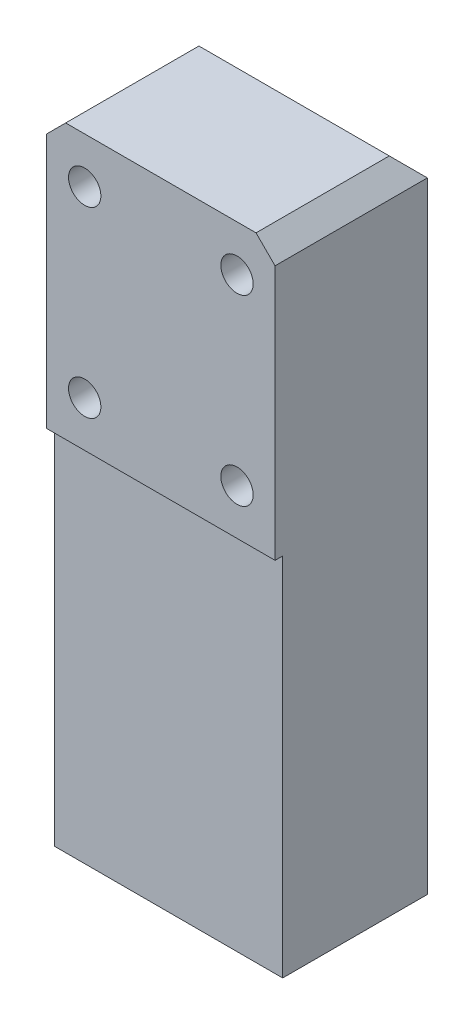
ISO-10303-21;
HEADER;
FILE_DESCRIPTION(('STEP AP214'),'2;1');
FILE_NAME('part.step','',(''),(''),'','','');
FILE_SCHEMA(('AUTOMOTIVE_DESIGN { 1 0 10303 214 1 1 1 1 }'));
ENDSEC;
DATA;
#1=APPLICATION_CONTEXT('core data for automotive mechanical design processes');
#2=APPLICATION_PROTOCOL_DEFINITION('international standard','automotive_design',2000,#1);
#3=PRODUCT_CONTEXT('',#1,'mechanical');
#4=PRODUCT('Part','Part','',(#3));
#5=PRODUCT_RELATED_PRODUCT_CATEGORY('part','',(#4));
#6=PRODUCT_DEFINITION_FORMATION('','',#4);
#7=PRODUCT_DEFINITION_CONTEXT('part definition',#1,'design');
#8=PRODUCT_DEFINITION('design','',#6,#7);
#9=PRODUCT_DEFINITION_SHAPE('','',#8);
#10=(LENGTH_UNIT() NAMED_UNIT(*) SI_UNIT(.MILLI.,.METRE.));
#11=(NAMED_UNIT(*) PLANE_ANGLE_UNIT() SI_UNIT($,.RADIAN.));
#12=(NAMED_UNIT(*) SI_UNIT($,.STERADIAN.) SOLID_ANGLE_UNIT());
#13=UNCERTAINTY_MEASURE_WITH_UNIT(LENGTH_MEASURE(1.E-05),#10,'distance_accuracy_value','');
#14=(GEOMETRIC_REPRESENTATION_CONTEXT(3) GLOBAL_UNCERTAINTY_ASSIGNED_CONTEXT((#13)) GLOBAL_UNIT_ASSIGNED_CONTEXT((#10,
#11,#12)) REPRESENTATION_CONTEXT('',''));
#15=CARTESIAN_POINT('',(0.,0.,0.));
#16=DIRECTION('',(0.,0.,1.));
#17=DIRECTION('',(1.,0.,0.));
#18=AXIS2_PLACEMENT_3D('',#15,#16,#17);
#19=CARTESIAN_POINT('',(-30.,-168.,0.));
#20=DIRECTION('',(0.,0.,-1.));
#21=DIRECTION('',(-1.,0.,0.));
#22=AXIS2_PLACEMENT_3D('',#19,#20,#21);
#23=PLANE('',#22);
#24=CARTESIAN_POINT('',(-20.,-60.,0.));
#25=DIRECTION('',(0.,0.,-1.));
#26=DIRECTION('',(-1.,0.,0.));
#27=AXIS2_PLACEMENT_3D('',#24,#25,#26);
#28=CIRCLE('',#27,6.5);
#29=CARTESIAN_POINT('',(-26.5,-60.,0.));
#30=VERTEX_POINT('',#29);
#31=EDGE_CURVE('E521',#30,#30,#28,.T.);
#32=ORIENTED_EDGE('',*,*,#31,.F.);
#33=EDGE_LOOP('',(#32));
#34=FACE_BOUND('',#33,.T.);
#35=CARTESIAN_POINT('',(20.,-60.,0.));
#36=DIRECTION('',(0.,0.,-1.));
#37=DIRECTION('',(-1.,0.,0.));
#38=AXIS2_PLACEMENT_3D('',#35,#36,#37);
#39=CIRCLE('',#38,6.5);
#40=CARTESIAN_POINT('',(13.5,-60.,0.));
#41=VERTEX_POINT('',#40);
#42=EDGE_CURVE('E527',#41,#41,#39,.T.);
#43=ORIENTED_EDGE('',*,*,#42,.F.);
#44=EDGE_LOOP('',(#43));
#45=FACE_BOUND('',#44,.T.);
#46=CARTESIAN_POINT('',(-20.,-12.,0.));
#47=DIRECTION('',(0.,0.,-1.));
#48=DIRECTION('',(-1.,0.,0.));
#49=AXIS2_PLACEMENT_3D('',#46,#47,#48);
#50=CIRCLE('',#49,6.5);
#51=CARTESIAN_POINT('',(-26.5,-12.,0.));
#52=VERTEX_POINT('',#51);
#53=EDGE_CURVE('E533',#52,#52,#50,.T.);
#54=ORIENTED_EDGE('',*,*,#53,.F.);
#55=EDGE_LOOP('',(#54));
#56=FACE_BOUND('',#55,.T.);
#57=CARTESIAN_POINT('',(20.,-12.,0.));
#58=DIRECTION('',(0.,0.,-1.));
#59=DIRECTION('',(-1.,0.,0.));
#60=AXIS2_PLACEMENT_3D('',#57,#58,#59);
#61=CIRCLE('',#60,6.5);
#62=CARTESIAN_POINT('',(13.5,-12.,0.));
#63=VERTEX_POINT('',#62);
#64=EDGE_CURVE('E539',#63,#63,#61,.T.);
#65=ORIENTED_EDGE('',*,*,#64,.F.);
#66=EDGE_LOOP('',(#65));
#67=FACE_BOUND('',#66,.T.);
#68=DIRECTION('',(0.,1.,0.));
#69=VECTOR('',#68,1.);
#70=CARTESIAN_POINT('',(-30.,-168.,0.));
#71=LINE('',#70,#69);
#72=CARTESIAN_POINT('',(-30.,-168.,0.));
#73=VERTEX_POINT('',#72);
#74=CARTESIAN_POINT('',(-30.,-5.,0.));
#75=VERTEX_POINT('',#74);
#76=EDGE_CURVE('E132',#73,#75,#71,.T.);
#77=ORIENTED_EDGE('',*,*,#76,.T.);
#78=DIRECTION('',(1.,0.,0.));
#79=VECTOR('',#78,1.);
#80=CARTESIAN_POINT('',(-30.,-5.,0.));
#81=LINE('',#80,#79);
#82=CARTESIAN_POINT('',(30.,-5.,0.));
#83=VERTEX_POINT('',#82);
#84=EDGE_CURVE('E146',#75,#83,#81,.T.);
#85=ORIENTED_EDGE('',*,*,#84,.T.);
#86=DIRECTION('',(0.,1.,0.));
#87=VECTOR('',#86,1.);
#88=CARTESIAN_POINT('',(30.,-168.,0.));
#89=LINE('',#88,#87);
#90=CARTESIAN_POINT('',(30.,-168.,0.));
#91=VERTEX_POINT('',#90);
#92=EDGE_CURVE('E110',#91,#83,#89,.T.);
#93=ORIENTED_EDGE('',*,*,#92,.F.);
#94=DIRECTION('',(1.,0.,0.));
#95=VECTOR('',#94,1.);
#96=CARTESIAN_POINT('',(-30.,-168.,0.));
#97=LINE('',#96,#95);
#98=EDGE_CURVE('E144',#73,#91,#97,.T.);
#99=ORIENTED_EDGE('',*,*,#98,.F.);
#100=EDGE_LOOP('',(#77,#85,#93,#99));
#101=FACE_BOUND('',#100,.T.);
#102=ADVANCED_FACE('F32',(#34,#45,#56,#67,#101),#23,.T.);
#103=CARTESIAN_POINT('',(-30.,-168.,38.));
#104=DIRECTION('',(0.,-1.,0.));
#105=DIRECTION('',(0.,0.,-1.));
#106=AXIS2_PLACEMENT_3D('',#103,#104,#105);
#107=PLANE('',#106);
#108=CARTESIAN_POINT('',(22.,-168.,8.));
#109=DIRECTION('',(0.,-1.,0.));
#110=DIRECTION('',(0.,0.,-1.));
#111=AXIS2_PLACEMENT_3D('',#108,#109,#110);
#112=CIRCLE('',#111,4.);
#113=CARTESIAN_POINT('',(22.,-168.,4.));
#114=VERTEX_POINT('',#113);
#115=EDGE_CURVE('E477',#114,#114,#112,.T.);
#116=ORIENTED_EDGE('',*,*,#115,.F.);
#117=EDGE_LOOP('',(#116));
#118=FACE_BOUND('',#117,.T.);
#119=CARTESIAN_POINT('',(22.,-168.,30.));
#120=DIRECTION('',(0.,-1.,0.));
#121=DIRECTION('',(0.,0.,-1.));
#122=AXIS2_PLACEMENT_3D('',#119,#120,#121);
#123=CIRCLE('',#122,4.);
#124=CARTESIAN_POINT('',(22.,-168.,26.));
#125=VERTEX_POINT('',#124);
#126=EDGE_CURVE('E476',#125,#125,#123,.T.);
#127=ORIENTED_EDGE('',*,*,#126,.F.);
#128=EDGE_LOOP('',(#127));
#129=FACE_BOUND('',#128,.T.);
#130=CARTESIAN_POINT('',(-22.,-168.,8.));
#131=DIRECTION('',(0.,-1.,0.));
#132=DIRECTION('',(0.,0.,-1.));
#133=AXIS2_PLACEMENT_3D('',#130,#131,#132);
#134=CIRCLE('',#133,4.);
#135=CARTESIAN_POINT('',(-22.,-168.,4.));
#136=VERTEX_POINT('',#135);
#137=EDGE_CURVE('E486',#136,#136,#134,.T.);
#138=ORIENTED_EDGE('',*,*,#137,.F.);
#139=EDGE_LOOP('',(#138));
#140=FACE_BOUND('',#139,.T.);
#141=CARTESIAN_POINT('',(-22.,-168.,30.));
#142=DIRECTION('',(0.,-1.,0.));
#143=DIRECTION('',(0.,0.,-1.));
#144=AXIS2_PLACEMENT_3D('',#141,#142,#143);
#145=CIRCLE('',#144,4.);
#146=CARTESIAN_POINT('',(-22.,-168.,26.));
#147=VERTEX_POINT('',#146);
#148=EDGE_CURVE('E491',#147,#147,#145,.T.);
#149=ORIENTED_EDGE('',*,*,#148,.F.);
#150=EDGE_LOOP('',(#149));
#151=FACE_BOUND('',#150,.T.);
#152=ORIENTED_EDGE('',*,*,#98,.T.);
#153=DIRECTION('',(0.,0.,-1.));
#154=VECTOR('',#153,1.);
#155=CARTESIAN_POINT('',(30.,-168.,38.));
#156=LINE('',#155,#154);
#157=CARTESIAN_POINT('',(30.,-168.,38.));
#158=VERTEX_POINT('',#157);
#159=EDGE_CURVE('E126',#158,#91,#156,.T.);
#160=ORIENTED_EDGE('',*,*,#159,.F.);
#161=DIRECTION('',(1.,0.,0.));
#162=VECTOR('',#161,1.);
#163=CARTESIAN_POINT('',(-30.,-168.,38.));
#164=LINE('',#163,#162);
#165=CARTESIAN_POINT('',(-30.,-168.,38.));
#166=VERTEX_POINT('',#165);
#167=EDGE_CURVE('E147',#166,#158,#164,.T.);
#168=ORIENTED_EDGE('',*,*,#167,.F.);
#169=DIRECTION('',(0.,0.,-1.));
#170=VECTOR('',#169,1.);
#171=CARTESIAN_POINT('',(-30.,-168.,38.));
#172=LINE('',#171,#170);
#173=EDGE_CURVE('E141',#166,#73,#172,.T.);
#174=ORIENTED_EDGE('',*,*,#173,.T.);
#175=EDGE_LOOP('',(#152,#160,#168,#174));
#176=FACE_BOUND('',#175,.T.);
#177=ADVANCED_FACE('F185',(#118,#129,#140,#151,#176),#107,.T.);
#178=CARTESIAN_POINT('',(-30.,-72.,38.));
#179=DIRECTION('',(0.,0.,1.));
#180=DIRECTION('',(0.,-1.,0.));
#181=AXIS2_PLACEMENT_3D('',#178,#179,#180);
#182=PLANE('',#181);
#183=ORIENTED_EDGE('',*,*,#167,.T.);
#184=DIRECTION('',(0.,-1.,0.));
#185=VECTOR('',#184,1.);
#186=CARTESIAN_POINT('',(30.,-72.,38.));
#187=LINE('',#186,#185);
#188=CARTESIAN_POINT('',(30.,-72.,38.));
#189=VERTEX_POINT('',#188);
#190=EDGE_CURVE('E124',#189,#158,#187,.T.);
#191=ORIENTED_EDGE('',*,*,#190,.F.);
#192=DIRECTION('',(1.,0.,0.));
#193=VECTOR('',#192,1.);
#194=CARTESIAN_POINT('',(-30.,-72.,38.));
#195=LINE('',#194,#193);
#196=CARTESIAN_POINT('',(-30.,-72.,38.));
#197=VERTEX_POINT('',#196);
#198=EDGE_CURVE('E120',#197,#189,#195,.T.);
#199=ORIENTED_EDGE('',*,*,#198,.F.);
#200=DIRECTION('',(0.,-1.,0.));
#201=VECTOR('',#200,1.);
#202=CARTESIAN_POINT('',(-30.,-72.,38.));
#203=LINE('',#202,#201);
#204=EDGE_CURVE('E138',#197,#166,#203,.T.);
#205=ORIENTED_EDGE('',*,*,#204,.T.);
#206=EDGE_LOOP('',(#183,#191,#199,#205));
#207=FACE_BOUND('',#206,.T.);
#208=ADVANCED_FACE('F183',(#207),#182,.T.);
#209=CARTESIAN_POINT('',(-30.,-72.,40.));
#210=DIRECTION('',(0.,-1.,0.));
#211=DIRECTION('',(0.,0.,-1.));
#212=AXIS2_PLACEMENT_3D('',#209,#210,#211);
#213=PLANE('',#212);
#214=ORIENTED_EDGE('',*,*,#198,.T.);
#215=DIRECTION('',(0.,0.,-1.));
#216=VECTOR('',#215,1.);
#217=CARTESIAN_POINT('',(30.,-72.,40.));
#218=LINE('',#217,#216);
#219=CARTESIAN_POINT('',(30.,-72.,40.));
#220=VERTEX_POINT('',#219);
#221=EDGE_CURVE('E105',#220,#189,#218,.T.);
#222=ORIENTED_EDGE('',*,*,#221,.F.);
#223=DIRECTION('',(1.,0.,0.));
#224=VECTOR('',#223,1.);
#225=CARTESIAN_POINT('',(-30.,-72.,40.));
#226=LINE('',#225,#224);
#227=CARTESIAN_POINT('',(-30.,-72.,40.));
#228=VERTEX_POINT('',#227);
#229=EDGE_CURVE('E113',#228,#220,#226,.T.);
#230=ORIENTED_EDGE('',*,*,#229,.F.);
#231=DIRECTION('',(0.,0.,-1.));
#232=VECTOR('',#231,1.);
#233=CARTESIAN_POINT('',(-30.,-72.,40.));
#234=LINE('',#233,#232);
#235=EDGE_CURVE('E136',#228,#197,#234,.T.);
#236=ORIENTED_EDGE('',*,*,#235,.T.);
#237=EDGE_LOOP('',(#214,#222,#230,#236));
#238=FACE_BOUND('',#237,.T.);
#239=ADVANCED_FACE('F123',(#238),#213,.T.);
#240=CARTESIAN_POINT('',(-30.,0.,40.));
#241=DIRECTION('',(0.,0.,1.));
#242=DIRECTION('',(0.,-1.,0.));
#243=AXIS2_PLACEMENT_3D('',#240,#241,#242);
#244=PLANE('',#243);
#245=CARTESIAN_POINT('',(20.,-60.,40.));
#246=DIRECTION('',(0.,0.,1.));
#247=DIRECTION('',(0.,-1.,0.));
#248=AXIS2_PLACEMENT_3D('',#245,#246,#247);
#249=CIRCLE('',#248,4.25);
#250=CARTESIAN_POINT('',(20.,-64.25,40.));
#251=VERTEX_POINT('',#250);
#252=EDGE_CURVE('E497',#251,#251,#249,.F.);
#253=ORIENTED_EDGE('',*,*,#252,.T.);
#254=EDGE_LOOP('',(#253));
#255=FACE_BOUND('',#254,.T.);
#256=CARTESIAN_POINT('',(-20.,-60.,40.));
#257=DIRECTION('',(0.,0.,1.));
#258=DIRECTION('',(0.,-1.,0.));
#259=AXIS2_PLACEMENT_3D('',#256,#257,#258);
#260=CIRCLE('',#259,4.25);
#261=CARTESIAN_POINT('',(-20.,-64.25,40.));
#262=VERTEX_POINT('',#261);
#263=EDGE_CURVE('E503',#262,#262,#260,.F.);
#264=ORIENTED_EDGE('',*,*,#263,.T.);
#265=EDGE_LOOP('',(#264));
#266=FACE_BOUND('',#265,.T.);
#267=CARTESIAN_POINT('',(-20.,-12.,40.));
#268=DIRECTION('',(0.,0.,1.));
#269=DIRECTION('',(0.,-1.,0.));
#270=AXIS2_PLACEMENT_3D('',#267,#268,#269);
#271=CIRCLE('',#270,4.25);
#272=CARTESIAN_POINT('',(-20.,-16.25,40.));
#273=VERTEX_POINT('',#272);
#274=EDGE_CURVE('E509',#273,#273,#271,.F.);
#275=ORIENTED_EDGE('',*,*,#274,.T.);
#276=EDGE_LOOP('',(#275));
#277=FACE_BOUND('',#276,.T.);
#278=CARTESIAN_POINT('',(20.,-12.,40.));
#279=DIRECTION('',(0.,0.,1.));
#280=DIRECTION('',(0.,-1.,0.));
#281=AXIS2_PLACEMENT_3D('',#278,#279,#280);
#282=CIRCLE('',#281,4.25);
#283=CARTESIAN_POINT('',(20.,-16.25,40.));
#284=VERTEX_POINT('',#283);
#285=EDGE_CURVE('E515',#284,#284,#282,.F.);
#286=ORIENTED_EDGE('',*,*,#285,.T.);
#287=EDGE_LOOP('',(#286));
#288=FACE_BOUND('',#287,.T.);
#289=DIRECTION('',(0.,-1.,0.));
#290=VECTOR('',#289,1.);
#291=CARTESIAN_POINT('',(30.,0.,40.));
#292=LINE('',#291,#290);
#293=CARTESIAN_POINT('',(30.,-5.00000000000003,40.));
#294=VERTEX_POINT('',#293);
#295=EDGE_CURVE('E99',#294,#220,#292,.T.);
#296=ORIENTED_EDGE('',*,*,#295,.F.);
#297=DIRECTION('',(0.707106781186549,-0.707106781186546,0.));
#298=VECTOR('',#297,1.);
#299=CARTESIAN_POINT('',(-2.50000000000018,27.5,40.));
#300=LINE('',#299,#298);
#301=CARTESIAN_POINT('',(24.9999999999999,0.,40.));
#302=VERTEX_POINT('',#301);
#303=EDGE_CURVE('E158',#294,#302,#300,.F.);
#304=ORIENTED_EDGE('',*,*,#303,.T.);
#305=DIRECTION('',(1.,0.,0.));
#306=VECTOR('',#305,1.);
#307=CARTESIAN_POINT('',(-30.,0.,40.));
#308=LINE('',#307,#306);
#309=CARTESIAN_POINT('',(-25.,0.,40.));
#310=VERTEX_POINT('',#309);
#311=EDGE_CURVE('E121',#310,#302,#308,.T.);
#312=ORIENTED_EDGE('',*,*,#311,.F.);
#313=DIRECTION('',(-0.707106781186546,-0.707106781186549,0.));
#314=VECTOR('',#313,1.);
#315=CARTESIAN_POINT('',(-27.5,-2.50000000000002,40.));
#316=LINE('',#315,#314);
#317=CARTESIAN_POINT('',(-30.,-5.00000000000006,40.));
#318=VERTEX_POINT('',#317);
#319=EDGE_CURVE('E156',#310,#318,#316,.T.);
#320=ORIENTED_EDGE('',*,*,#319,.T.);
#321=DIRECTION('',(0.,-1.,0.));
#322=VECTOR('',#321,1.);
#323=CARTESIAN_POINT('',(-30.,0.,40.));
#324=LINE('',#323,#322);
#325=EDGE_CURVE('E116',#318,#228,#324,.T.);
#326=ORIENTED_EDGE('',*,*,#325,.T.);
#327=ORIENTED_EDGE('',*,*,#229,.T.);
#328=EDGE_LOOP('',(#296,#304,#312,#320,#326,#327));
#329=FACE_BOUND('',#328,.T.);
#330=ADVANCED_FACE('F114',(#255,#266,#277,#288,#329),#244,.T.);
#331=CARTESIAN_POINT('',(-30.,0.,0.));
#332=DIRECTION('',(0.,1.,0.));
#333=DIRECTION('',(0.,0.,1.));
#334=AXIS2_PLACEMENT_3D('',#331,#332,#333);
#335=PLANE('',#334);
#336=ORIENTED_EDGE('',*,*,#311,.T.);
#337=DIRECTION('',(0.,0.,-1.));
#338=VECTOR('',#337,1.);
#339=CARTESIAN_POINT('',(24.9999999999999,0.,0.));
#340=LINE('',#339,#338);
#341=CARTESIAN_POINT('',(24.9999999999999,0.,5.00000000000003));
#342=VERTEX_POINT('',#341);
#343=EDGE_CURVE('E54',#302,#342,#340,.T.);
#344=ORIENTED_EDGE('',*,*,#343,.T.);
#345=DIRECTION('',(-1.,0.,0.));
#346=VECTOR('',#345,1.);
#347=CARTESIAN_POINT('',(-30.,0.,5.00000000000003));
#348=LINE('',#347,#346);
#349=CARTESIAN_POINT('',(-25.,0.,5.00000000000003));
#350=VERTEX_POINT('',#349);
#351=EDGE_CURVE('E153',#342,#350,#348,.T.);
#352=ORIENTED_EDGE('',*,*,#351,.T.);
#353=DIRECTION('',(0.,0.,1.));
#354=VECTOR('',#353,1.);
#355=CARTESIAN_POINT('',(-25.,0.,40.));
#356=LINE('',#355,#354);
#357=EDGE_CURVE('E160',#350,#310,#356,.T.);
#358=ORIENTED_EDGE('',*,*,#357,.T.);
#359=EDGE_LOOP('',(#336,#344,#352,#358));
#360=FACE_BOUND('',#359,.T.);
#361=ADVANCED_FACE('F174',(#360),#335,.T.);
#362=CARTESIAN_POINT('',(-30.,0.,0.));
#363=DIRECTION('',(1.,0.,0.));
#364=DIRECTION('',(0.,0.,-1.));
#365=AXIS2_PLACEMENT_3D('',#362,#363,#364);
#366=PLANE('',#365);
#367=ORIENTED_EDGE('',*,*,#325,.F.);
#368=DIRECTION('',(0.,0.,-1.));
#369=VECTOR('',#368,1.);
#370=CARTESIAN_POINT('',(-30.,-5.00000000000006,5.00000000000003));
#371=LINE('',#370,#369);
#372=EDGE_CURVE('E11',#318,#75,#371,.T.);
#373=ORIENTED_EDGE('',*,*,#372,.T.);
#374=ORIENTED_EDGE('',*,*,#76,.F.);
#375=ORIENTED_EDGE('',*,*,#173,.F.);
#376=ORIENTED_EDGE('',*,*,#204,.F.);
#377=ORIENTED_EDGE('',*,*,#235,.F.);
#378=EDGE_LOOP('',(#367,#373,#374,#375,#376,#377));
#379=FACE_BOUND('',#378,.T.);
#380=ADVANCED_FACE('F179',(#379),#366,.F.);
#381=CARTESIAN_POINT('',(30.,0.,0.));
#382=DIRECTION('',(1.,0.,0.));
#383=DIRECTION('',(0.,0.,-1.));
#384=AXIS2_PLACEMENT_3D('',#381,#382,#383);
#385=PLANE('',#384);
#386=ORIENTED_EDGE('',*,*,#92,.T.);
#387=DIRECTION('',(0.,0.,1.));
#388=VECTOR('',#387,1.);
#389=CARTESIAN_POINT('',(30.,-5.00000000000003,0.));
#390=LINE('',#389,#388);
#391=EDGE_CURVE('E108',#83,#294,#390,.T.);
#392=ORIENTED_EDGE('',*,*,#391,.T.);
#393=ORIENTED_EDGE('',*,*,#295,.T.);
#394=ORIENTED_EDGE('',*,*,#221,.T.);
#395=ORIENTED_EDGE('',*,*,#190,.T.);
#396=ORIENTED_EDGE('',*,*,#159,.T.);
#397=EDGE_LOOP('',(#386,#392,#393,#394,#395,#396));
#398=FACE_BOUND('',#397,.T.);
#399=ADVANCED_FACE('F102',(#398),#385,.T.);
#400=CARTESIAN_POINT('',(-30.,-5.,0.));
#401=DIRECTION('',(0.,-0.707106781186549,0.707106781186546));
#402=DIRECTION('',(1.,0.,0.));
#403=AXIS2_PLACEMENT_3D('',#400,#401,#402);
#404=PLANE('',#403);
#405=ORIENTED_EDGE('',*,*,#351,.F.);
#406=DIRECTION('',(0.577350269189627,-0.577350269189624,-0.577350269189627));
#407=VECTOR('',#406,1.);
#408=CARTESIAN_POINT('',(9.9999999999999,15.,20.0000000000001));
#409=LINE('',#408,#407);
#410=EDGE_CURVE('E40',#342,#83,#409,.T.);
#411=ORIENTED_EDGE('',*,*,#410,.T.);
#412=ORIENTED_EDGE('',*,*,#84,.F.);
#413=DIRECTION('',(-0.577350269189623,-0.577350269189626,-0.577350269189629));
#414=VECTOR('',#413,1.);
#415=CARTESIAN_POINT('',(-30.,-5.00000000000002,0.));
#416=LINE('',#415,#414);
#417=EDGE_CURVE('E47',#75,#350,#416,.F.);
#418=ORIENTED_EDGE('',*,*,#417,.T.);
#419=EDGE_LOOP('',(#405,#411,#412,#418));
#420=FACE_BOUND('',#419,.T.);
#421=ADVANCED_FACE('F165',(#420),#404,.F.);
#422=CARTESIAN_POINT('',(30.,-5.00000000000003,0.));
#423=DIRECTION('',(-0.707106781186546,-0.707106781186549,0.));
#424=DIRECTION('',(0.,0.,1.));
#425=AXIS2_PLACEMENT_3D('',#422,#423,#424);
#426=PLANE('',#425);
#427=ORIENTED_EDGE('',*,*,#410,.F.);
#428=ORIENTED_EDGE('',*,*,#343,.F.);
#429=ORIENTED_EDGE('',*,*,#303,.F.);
#430=ORIENTED_EDGE('',*,*,#391,.F.);
#431=EDGE_LOOP('',(#427,#428,#429,#430));
#432=FACE_BOUND('',#431,.T.);
#433=ADVANCED_FACE('F172',(#432),#426,.F.);
#434=CARTESIAN_POINT('',(-25.,0.,0.));
#435=DIRECTION('',(-0.707106781186549,0.707106781186546,0.));
#436=DIRECTION('',(0.,0.,-1.));
#437=AXIS2_PLACEMENT_3D('',#434,#435,#436);
#438=PLANE('',#437);
#439=ORIENTED_EDGE('',*,*,#417,.F.);
#440=ORIENTED_EDGE('',*,*,#372,.F.);
#441=ORIENTED_EDGE('',*,*,#319,.F.);
#442=ORIENTED_EDGE('',*,*,#357,.F.);
#443=EDGE_LOOP('',(#439,#440,#441,#442));
#444=FACE_BOUND('',#443,.T.);
#445=ADVANCED_FACE('F34',(#444),#438,.T.);
#446=CARTESIAN_POINT('',(20.,-12.,9.));
#447=DIRECTION('',(0.,0.,-1.));
#448=DIRECTION('',(-1.,0.,0.));
#449=AXIS2_PLACEMENT_3D('',#446,#447,#448);
#450=CYLINDRICAL_SURFACE('',#449,6.5);
#451=CARTESIAN_POINT('',(20.,-12.,9.));
#452=DIRECTION('',(0.,0.,-1.));
#453=DIRECTION('',(-1.,0.,0.));
#454=AXIS2_PLACEMENT_3D('',#451,#452,#453);
#455=CIRCLE('',#454,6.5);
#456=CARTESIAN_POINT('',(13.5,-12.,9.));
#457=VERTEX_POINT('',#456);
#458=EDGE_CURVE('E171',#457,#457,#455,.T.);
#459=ORIENTED_EDGE('',*,*,#458,.F.);
#460=EDGE_LOOP('',(#459));
#461=FACE_BOUND('',#460,.T.);
#462=ORIENTED_EDGE('',*,*,#64,.T.);
#463=EDGE_LOOP('',(#462));
#464=FACE_BOUND('',#463,.T.);
#465=ADVANCED_FACE('F213',(#461,#464),#450,.F.);
#466=CARTESIAN_POINT('',(20.,-12.,9.));
#467=DIRECTION('',(0.,0.,-1.));
#468=DIRECTION('',(-1.,0.,0.));
#469=AXIS2_PLACEMENT_3D('',#466,#467,#468);
#470=PLANE('',#469);
#471=CARTESIAN_POINT('',(20.,-12.,9.));
#472=DIRECTION('',(0.,0.,-1.));
#473=DIRECTION('',(-1.,0.,0.));
#474=AXIS2_PLACEMENT_3D('',#471,#472,#473);
#475=CIRCLE('',#474,4.25);
#476=CARTESIAN_POINT('',(15.75,-12.,9.));
#477=VERTEX_POINT('',#476);
#478=EDGE_CURVE('E518',#477,#477,#475,.T.);
#479=ORIENTED_EDGE('',*,*,#478,.F.);
#480=EDGE_LOOP('',(#479));
#481=FACE_BOUND('',#480,.T.);
#482=ORIENTED_EDGE('',*,*,#458,.T.);
#483=EDGE_LOOP('',(#482));
#484=FACE_BOUND('',#483,.T.);
#485=ADVANCED_FACE('F217',(#481,#484),#470,.T.);
#486=CARTESIAN_POINT('',(-20.,-12.,9.));
#487=DIRECTION('',(0.,0.,-1.));
#488=DIRECTION('',(-1.,0.,0.));
#489=AXIS2_PLACEMENT_3D('',#486,#487,#488);
#490=CYLINDRICAL_SURFACE('',#489,6.5);
#491=CARTESIAN_POINT('',(-20.,-12.,9.));
#492=DIRECTION('',(0.,0.,-1.));
#493=DIRECTION('',(-1.,0.,0.));
#494=AXIS2_PLACEMENT_3D('',#491,#492,#493);
#495=CIRCLE('',#494,6.5);
#496=CARTESIAN_POINT('',(-26.5,-12.,9.));
#497=VERTEX_POINT('',#496);
#498=EDGE_CURVE('E536',#497,#497,#495,.T.);
#499=ORIENTED_EDGE('',*,*,#498,.F.);
#500=EDGE_LOOP('',(#499));
#501=FACE_BOUND('',#500,.T.);
#502=ORIENTED_EDGE('',*,*,#53,.T.);
#503=EDGE_LOOP('',(#502));
#504=FACE_BOUND('',#503,.T.);
#505=ADVANCED_FACE('F223',(#501,#504),#490,.F.);
#506=CARTESIAN_POINT('',(-20.,-12.,9.));
#507=DIRECTION('',(0.,0.,-1.));
#508=DIRECTION('',(-1.,0.,0.));
#509=AXIS2_PLACEMENT_3D('',#506,#507,#508);
#510=PLANE('',#509);
#511=CARTESIAN_POINT('',(-20.,-12.,9.));
#512=DIRECTION('',(0.,0.,-1.));
#513=DIRECTION('',(-1.,0.,0.));
#514=AXIS2_PLACEMENT_3D('',#511,#512,#513);
#515=CIRCLE('',#514,4.25);
#516=CARTESIAN_POINT('',(-24.25,-12.,9.));
#517=VERTEX_POINT('',#516);
#518=EDGE_CURVE('E512',#517,#517,#515,.T.);
#519=ORIENTED_EDGE('',*,*,#518,.F.);
#520=EDGE_LOOP('',(#519));
#521=FACE_BOUND('',#520,.T.);
#522=ORIENTED_EDGE('',*,*,#498,.T.);
#523=EDGE_LOOP('',(#522));
#524=FACE_BOUND('',#523,.T.);
#525=ADVANCED_FACE('F302',(#521,#524),#510,.T.);
#526=CARTESIAN_POINT('',(20.,-60.,9.));
#527=DIRECTION('',(0.,0.,-1.));
#528=DIRECTION('',(-1.,0.,0.));
#529=AXIS2_PLACEMENT_3D('',#526,#527,#528);
#530=CYLINDRICAL_SURFACE('',#529,6.5);
#531=CARTESIAN_POINT('',(20.,-60.,9.));
#532=DIRECTION('',(0.,0.,-1.));
#533=DIRECTION('',(-1.,0.,0.));
#534=AXIS2_PLACEMENT_3D('',#531,#532,#533);
#535=CIRCLE('',#534,6.5);
#536=CARTESIAN_POINT('',(13.5,-60.,9.));
#537=VERTEX_POINT('',#536);
#538=EDGE_CURVE('E530',#537,#537,#535,.T.);
#539=ORIENTED_EDGE('',*,*,#538,.F.);
#540=EDGE_LOOP('',(#539));
#541=FACE_BOUND('',#540,.T.);
#542=ORIENTED_EDGE('',*,*,#42,.T.);
#543=EDGE_LOOP('',(#542));
#544=FACE_BOUND('',#543,.T.);
#545=ADVANCED_FACE('F310',(#541,#544),#530,.F.);
#546=CARTESIAN_POINT('',(20.,-60.,9.));
#547=DIRECTION('',(0.,0.,-1.));
#548=DIRECTION('',(-1.,0.,0.));
#549=AXIS2_PLACEMENT_3D('',#546,#547,#548);
#550=PLANE('',#549);
#551=CARTESIAN_POINT('',(20.,-60.,9.));
#552=DIRECTION('',(0.,0.,-1.));
#553=DIRECTION('',(-1.,0.,0.));
#554=AXIS2_PLACEMENT_3D('',#551,#552,#553);
#555=CIRCLE('',#554,4.25);
#556=CARTESIAN_POINT('',(15.75,-60.,9.));
#557=VERTEX_POINT('',#556);
#558=EDGE_CURVE('E500',#557,#557,#555,.T.);
#559=ORIENTED_EDGE('',*,*,#558,.F.);
#560=EDGE_LOOP('',(#559));
#561=FACE_BOUND('',#560,.T.);
#562=ORIENTED_EDGE('',*,*,#538,.T.);
#563=EDGE_LOOP('',(#562));
#564=FACE_BOUND('',#563,.T.);
#565=ADVANCED_FACE('F319',(#561,#564),#550,.T.);
#566=CARTESIAN_POINT('',(-20.,-60.,9.));
#567=DIRECTION('',(0.,0.,-1.));
#568=DIRECTION('',(-1.,0.,0.));
#569=AXIS2_PLACEMENT_3D('',#566,#567,#568);
#570=CYLINDRICAL_SURFACE('',#569,6.5);
#571=CARTESIAN_POINT('',(-20.,-60.,9.));
#572=DIRECTION('',(0.,0.,-1.));
#573=DIRECTION('',(-1.,0.,0.));
#574=AXIS2_PLACEMENT_3D('',#571,#572,#573);
#575=CIRCLE('',#574,6.5);
#576=CARTESIAN_POINT('',(-26.5,-60.,9.));
#577=VERTEX_POINT('',#576);
#578=EDGE_CURVE('E524',#577,#577,#575,.T.);
#579=ORIENTED_EDGE('',*,*,#578,.F.);
#580=EDGE_LOOP('',(#579));
#581=FACE_BOUND('',#580,.T.);
#582=ORIENTED_EDGE('',*,*,#31,.T.);
#583=EDGE_LOOP('',(#582));
#584=FACE_BOUND('',#583,.T.);
#585=ADVANCED_FACE('F327',(#581,#584),#570,.F.);
#586=CARTESIAN_POINT('',(-20.,-60.,9.));
#587=DIRECTION('',(0.,0.,-1.));
#588=DIRECTION('',(-1.,0.,0.));
#589=AXIS2_PLACEMENT_3D('',#586,#587,#588);
#590=PLANE('',#589);
#591=CARTESIAN_POINT('',(-20.,-60.,9.));
#592=DIRECTION('',(0.,0.,-1.));
#593=DIRECTION('',(-1.,0.,0.));
#594=AXIS2_PLACEMENT_3D('',#591,#592,#593);
#595=CIRCLE('',#594,4.25);
#596=CARTESIAN_POINT('',(-24.25,-60.,9.));
#597=VERTEX_POINT('',#596);
#598=EDGE_CURVE('E506',#597,#597,#595,.T.);
#599=ORIENTED_EDGE('',*,*,#598,.F.);
#600=EDGE_LOOP('',(#599));
#601=FACE_BOUND('',#600,.T.);
#602=ORIENTED_EDGE('',*,*,#578,.T.);
#603=EDGE_LOOP('',(#602));
#604=FACE_BOUND('',#603,.T.);
#605=ADVANCED_FACE('F336',(#601,#604),#590,.T.);
#606=CARTESIAN_POINT('',(20.,-12.,40.001));
#607=DIRECTION('',(0.,0.,-1.));
#608=DIRECTION('',(-1.,0.,0.));
#609=AXIS2_PLACEMENT_3D('',#606,#607,#608);
#610=CYLINDRICAL_SURFACE('',#609,4.25);
#611=ORIENTED_EDGE('',*,*,#285,.F.);
#612=EDGE_LOOP('',(#611));
#613=FACE_BOUND('',#612,.T.);
#614=ORIENTED_EDGE('',*,*,#478,.T.);
#615=EDGE_LOOP('',(#614));
#616=FACE_BOUND('',#615,.T.);
#617=ADVANCED_FACE('F344',(#613,#616),#610,.F.);
#618=CARTESIAN_POINT('',(-20.,-12.,40.001));
#619=DIRECTION('',(0.,0.,-1.));
#620=DIRECTION('',(-1.,0.,0.));
#621=AXIS2_PLACEMENT_3D('',#618,#619,#620);
#622=CYLINDRICAL_SURFACE('',#621,4.25);
#623=ORIENTED_EDGE('',*,*,#274,.F.);
#624=EDGE_LOOP('',(#623));
#625=FACE_BOUND('',#624,.T.);
#626=ORIENTED_EDGE('',*,*,#518,.T.);
#627=EDGE_LOOP('',(#626));
#628=FACE_BOUND('',#627,.T.);
#629=ADVANCED_FACE('F353',(#625,#628),#622,.F.);
#630=CARTESIAN_POINT('',(-20.,-60.,40.001));
#631=DIRECTION('',(0.,0.,-1.));
#632=DIRECTION('',(-1.,0.,0.));
#633=AXIS2_PLACEMENT_3D('',#630,#631,#632);
#634=CYLINDRICAL_SURFACE('',#633,4.25);
#635=ORIENTED_EDGE('',*,*,#263,.F.);
#636=EDGE_LOOP('',(#635));
#637=FACE_BOUND('',#636,.T.);
#638=ORIENTED_EDGE('',*,*,#598,.T.);
#639=EDGE_LOOP('',(#638));
#640=FACE_BOUND('',#639,.T.);
#641=ADVANCED_FACE('F362',(#637,#640),#634,.F.);
#642=CARTESIAN_POINT('',(20.,-60.,40.001));
#643=DIRECTION('',(0.,0.,-1.));
#644=DIRECTION('',(-1.,0.,0.));
#645=AXIS2_PLACEMENT_3D('',#642,#643,#644);
#646=CYLINDRICAL_SURFACE('',#645,4.25);
#647=ORIENTED_EDGE('',*,*,#252,.F.);
#648=EDGE_LOOP('',(#647));
#649=FACE_BOUND('',#648,.T.);
#650=ORIENTED_EDGE('',*,*,#558,.T.);
#651=EDGE_LOOP('',(#650));
#652=FACE_BOUND('',#651,.T.);
#653=ADVANCED_FACE('F371',(#649,#652),#646,.F.);
#654=CARTESIAN_POINT('',(-22.,-138.,30.));
#655=DIRECTION('',(0.,-1.,0.));
#656=DIRECTION('',(0.,0.,-1.));
#657=AXIS2_PLACEMENT_3D('',#654,#655,#656);
#658=CYLINDRICAL_SURFACE('',#657,4.);
#659=CARTESIAN_POINT('',(-22.,-138.,30.));
#660=DIRECTION('',(0.,-1.,0.));
#661=DIRECTION('',(0.,0.,-1.));
#662=AXIS2_PLACEMENT_3D('',#659,#660,#661);
#663=CIRCLE('',#662,4.);
#664=CARTESIAN_POINT('',(-22.,-138.,26.));
#665=VERTEX_POINT('',#664);
#666=EDGE_CURVE('E494',#665,#665,#663,.T.);
#667=ORIENTED_EDGE('',*,*,#666,.F.);
#668=EDGE_LOOP('',(#667));
#669=FACE_BOUND('',#668,.T.);
#670=ORIENTED_EDGE('',*,*,#148,.T.);
#671=EDGE_LOOP('',(#670));
#672=FACE_BOUND('',#671,.T.);
#673=ADVANCED_FACE('F380',(#669,#672),#658,.F.);
#674=CARTESIAN_POINT('',(-22.,-138.,30.));
#675=DIRECTION('',(0.,-1.,0.));
#676=DIRECTION('',(0.,0.,-1.));
#677=AXIS2_PLACEMENT_3D('',#674,#675,#676);
#678=PLANE('',#677);
#679=ORIENTED_EDGE('',*,*,#666,.T.);
#680=EDGE_LOOP('',(#679));
#681=FACE_BOUND('',#680,.T.);
#682=ADVANCED_FACE('F389',(#681),#678,.T.);
#683=CARTESIAN_POINT('',(-22.,-138.,8.));
#684=DIRECTION('',(0.,-1.,0.));
#685=DIRECTION('',(0.,0.,-1.));
#686=AXIS2_PLACEMENT_3D('',#683,#684,#685);
#687=CYLINDRICAL_SURFACE('',#686,4.);
#688=CARTESIAN_POINT('',(-22.,-138.,8.));
#689=DIRECTION('',(0.,-1.,0.));
#690=DIRECTION('',(0.,0.,-1.));
#691=AXIS2_PLACEMENT_3D('',#688,#689,#690);
#692=CIRCLE('',#691,4.);
#693=CARTESIAN_POINT('',(-22.,-138.,4.));
#694=VERTEX_POINT('',#693);
#695=EDGE_CURVE('E488',#694,#694,#692,.T.);
#696=ORIENTED_EDGE('',*,*,#695,.F.);
#697=EDGE_LOOP('',(#696));
#698=FACE_BOUND('',#697,.T.);
#699=ORIENTED_EDGE('',*,*,#137,.T.);
#700=EDGE_LOOP('',(#699));
#701=FACE_BOUND('',#700,.T.);
#702=ADVANCED_FACE('F398',(#698,#701),#687,.F.);
#703=CARTESIAN_POINT('',(-22.,-138.,8.));
#704=DIRECTION('',(0.,-1.,0.));
#705=DIRECTION('',(0.,0.,-1.));
#706=AXIS2_PLACEMENT_3D('',#703,#704,#705);
#707=PLANE('',#706);
#708=ORIENTED_EDGE('',*,*,#695,.T.);
#709=EDGE_LOOP('',(#708));
#710=FACE_BOUND('',#709,.T.);
#711=ADVANCED_FACE('F407',(#710),#707,.T.);
#712=CARTESIAN_POINT('',(22.,-138.,30.));
#713=DIRECTION('',(0.,-1.,0.));
#714=DIRECTION('',(0.,0.,-1.));
#715=AXIS2_PLACEMENT_3D('',#712,#713,#714);
#716=CYLINDRICAL_SURFACE('',#715,4.);
#717=CARTESIAN_POINT('',(22.,-138.,30.));
#718=DIRECTION('',(0.,-1.,0.));
#719=DIRECTION('',(0.,0.,-1.));
#720=AXIS2_PLACEMENT_3D('',#717,#718,#719);
#721=CIRCLE('',#720,4.);
#722=CARTESIAN_POINT('',(22.,-138.,26.));
#723=VERTEX_POINT('',#722);
#724=EDGE_CURVE('E480',#723,#723,#721,.T.);
#725=ORIENTED_EDGE('',*,*,#724,.F.);
#726=EDGE_LOOP('',(#725));
#727=FACE_BOUND('',#726,.T.);
#728=ORIENTED_EDGE('',*,*,#126,.T.);
#729=EDGE_LOOP('',(#728));
#730=FACE_BOUND('',#729,.T.);
#731=ADVANCED_FACE('F416',(#727,#730),#716,.F.);
#732=CARTESIAN_POINT('',(22.,-138.,30.));
#733=DIRECTION('',(0.,-1.,0.));
#734=DIRECTION('',(0.,0.,-1.));
#735=AXIS2_PLACEMENT_3D('',#732,#733,#734);
#736=PLANE('',#735);
#737=ORIENTED_EDGE('',*,*,#724,.T.);
#738=EDGE_LOOP('',(#737));
#739=FACE_BOUND('',#738,.T.);
#740=ADVANCED_FACE('F425',(#739),#736,.T.);
#741=CARTESIAN_POINT('',(22.,-138.,8.));
#742=DIRECTION('',(0.,-1.,0.));
#743=DIRECTION('',(0.,0.,-1.));
#744=AXIS2_PLACEMENT_3D('',#741,#742,#743);
#745=CYLINDRICAL_SURFACE('',#744,4.);
#746=CARTESIAN_POINT('',(22.,-138.,8.));
#747=DIRECTION('',(0.,-1.,0.));
#748=DIRECTION('',(0.,0.,-1.));
#749=AXIS2_PLACEMENT_3D('',#746,#747,#748);
#750=CIRCLE('',#749,4.);
#751=CARTESIAN_POINT('',(22.,-138.,4.));
#752=VERTEX_POINT('',#751);
#753=EDGE_CURVE('E475',#752,#752,#750,.T.);
#754=ORIENTED_EDGE('',*,*,#753,.F.);
#755=EDGE_LOOP('',(#754));
#756=FACE_BOUND('',#755,.T.);
#757=ORIENTED_EDGE('',*,*,#115,.T.);
#758=EDGE_LOOP('',(#757));
#759=FACE_BOUND('',#758,.T.);
#760=ADVANCED_FACE('F434',(#756,#759),#745,.F.);
#761=CARTESIAN_POINT('',(22.,-138.,8.));
#762=DIRECTION('',(0.,-1.,0.));
#763=DIRECTION('',(0.,0.,-1.));
#764=AXIS2_PLACEMENT_3D('',#761,#762,#763);
#765=PLANE('',#764);
#766=ORIENTED_EDGE('',*,*,#753,.T.);
#767=EDGE_LOOP('',(#766));
#768=FACE_BOUND('',#767,.T.);
#769=ADVANCED_FACE('F443',(#768),#765,.T.);
#770=CLOSED_SHELL('',(#102,#177,#208,#239,#330,#361,#380,#399,#421,#433,#445,#465,#485,#505,
#525,#545,#565,#585,#605,#617,#629,#641,#653,#673,#682,#702,#711,#731,#740,#760,#769));
#771=MANIFOLD_SOLID_BREP('B2',#770);
#772=ADVANCED_BREP_SHAPE_REPRESENTATION('',(#18,#771),#14);
#773=SHAPE_DEFINITION_REPRESENTATION(#9,#772);
ENDSEC;
END-ISO-10303-21;
